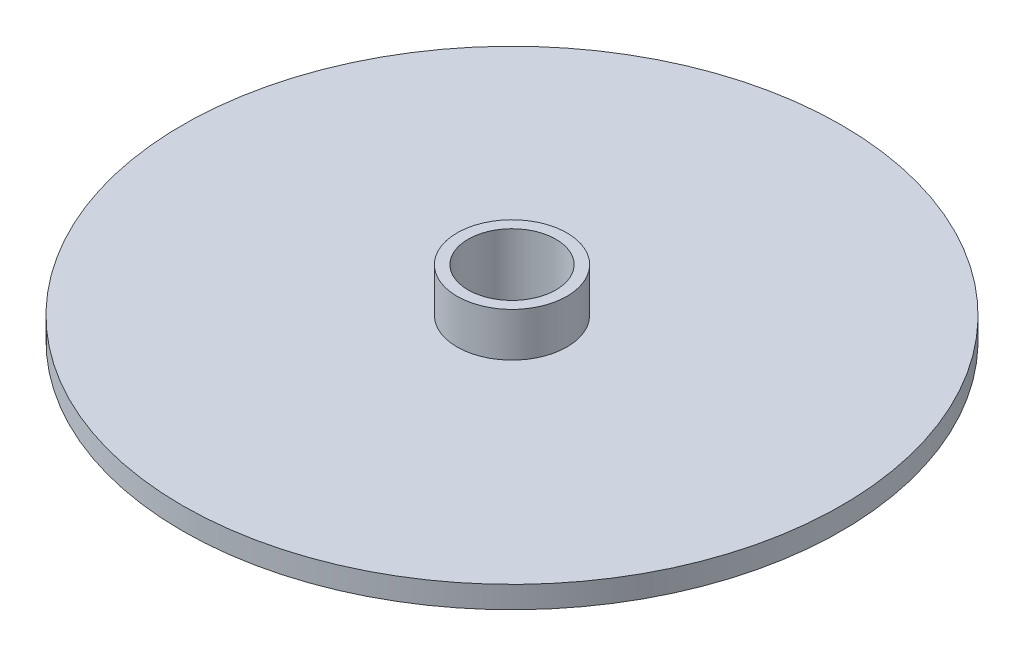
ISO-10303-21;
HEADER;
FILE_DESCRIPTION(('STEP AP214'),'2;1');
FILE_NAME('part.step','',(''),(''),'','','');
FILE_SCHEMA(('AUTOMOTIVE_DESIGN { 1 0 10303 214 1 1 1 1 }'));
ENDSEC;
DATA;
#1=APPLICATION_CONTEXT('core data for automotive mechanical design processes');
#2=APPLICATION_PROTOCOL_DEFINITION('international standard','automotive_design',2000,#1);
#3=PRODUCT_CONTEXT('',#1,'mechanical');
#4=PRODUCT('Part','Part','',(#3));
#5=PRODUCT_RELATED_PRODUCT_CATEGORY('part','',(#4));
#6=PRODUCT_DEFINITION_FORMATION('','',#4);
#7=PRODUCT_DEFINITION_CONTEXT('part definition',#1,'design');
#8=PRODUCT_DEFINITION('design','',#6,#7);
#9=PRODUCT_DEFINITION_SHAPE('','',#8);
#10=(LENGTH_UNIT() NAMED_UNIT(*) SI_UNIT(.MILLI.,.METRE.));
#11=(NAMED_UNIT(*) PLANE_ANGLE_UNIT() SI_UNIT($,.RADIAN.));
#12=(NAMED_UNIT(*) SI_UNIT($,.STERADIAN.) SOLID_ANGLE_UNIT());
#13=UNCERTAINTY_MEASURE_WITH_UNIT(LENGTH_MEASURE(1.E-05),#10,'distance_accuracy_value','');
#14=(GEOMETRIC_REPRESENTATION_CONTEXT(3) GLOBAL_UNCERTAINTY_ASSIGNED_CONTEXT((#13)) GLOBAL_UNIT_ASSIGNED_CONTEXT((#10,
#11,#12)) REPRESENTATION_CONTEXT('',''));
#15=CARTESIAN_POINT('',(0.,0.,0.));
#16=DIRECTION('',(0.,0.,1.));
#17=DIRECTION('',(1.,0.,0.));
#18=AXIS2_PLACEMENT_3D('',#15,#16,#17);
#19=CARTESIAN_POINT('',(0.,10.,0.));
#20=DIRECTION('',(0.,1.,0.));
#21=DIRECTION('',(0.,0.,1.));
#22=AXIS2_PLACEMENT_3D('',#19,#20,#21);
#23=PLANE('',#22);
#24=CARTESIAN_POINT('',(0.,10.,0.));
#25=DIRECTION('',(0.,1.,0.));
#26=DIRECTION('',(0.,0.,1.));
#27=AXIS2_PLACEMENT_3D('',#24,#25,#26);
#28=CIRCLE('',#27,150.);
#29=CARTESIAN_POINT('',(0.,10.,150.));
#30=VERTEX_POINT('',#29);
#31=EDGE_CURVE('E10',#30,#30,#28,.T.);
#32=ORIENTED_EDGE('',*,*,#31,.T.);
#33=EDGE_LOOP('',(#32));
#34=FACE_BOUND('',#33,.T.);
#35=CARTESIAN_POINT('',(0.,10.,0.));
#36=DIRECTION('',(0.,1.,0.));
#37=DIRECTION('',(0.,0.,1.));
#38=AXIS2_PLACEMENT_3D('',#35,#36,#37);
#39=CIRCLE('',#38,25.);
#40=CARTESIAN_POINT('',(0.,10.,25.));
#41=VERTEX_POINT('',#40);
#42=EDGE_CURVE('E55',#41,#41,#39,.T.);
#43=ORIENTED_EDGE('',*,*,#42,.F.);
#44=EDGE_LOOP('',(#43));
#45=FACE_BOUND('',#44,.T.);
#46=ADVANCED_FACE('F39',(#34,#45),#23,.T.);
#47=CARTESIAN_POINT('',(0.,10.,0.));
#48=DIRECTION('',(0.,-1.,0.));
#49=DIRECTION('',(0.,0.,-1.));
#50=AXIS2_PLACEMENT_3D('',#47,#48,#49);
#51=CYLINDRICAL_SURFACE('',#50,150.);
#52=ORIENTED_EDGE('',*,*,#31,.F.);
#53=EDGE_LOOP('',(#52));
#54=FACE_BOUND('',#53,.T.);
#55=CARTESIAN_POINT('',(0.,0.,0.));
#56=DIRECTION('',(0.,1.,0.));
#57=DIRECTION('',(0.,0.,1.));
#58=AXIS2_PLACEMENT_3D('',#55,#56,#57);
#59=CIRCLE('',#58,150.);
#60=CARTESIAN_POINT('',(0.,0.,150.));
#61=VERTEX_POINT('',#60);
#62=EDGE_CURVE('E53',#61,#61,#59,.T.);
#63=ORIENTED_EDGE('',*,*,#62,.T.);
#64=EDGE_LOOP('',(#63));
#65=FACE_BOUND('',#64,.T.);
#66=ADVANCED_FACE('F41',(#54,#65),#51,.T.);
#67=CARTESIAN_POINT('',(0.,10.,0.));
#68=DIRECTION('',(0.,-1.,0.));
#69=DIRECTION('',(0.,0.,-1.));
#70=AXIS2_PLACEMENT_3D('',#67,#68,#69);
#71=CYLINDRICAL_SURFACE('',#70,20.);
#72=CARTESIAN_POINT('',(0.,0.,0.));
#73=DIRECTION('',(0.,1.,0.));
#74=DIRECTION('',(0.,0.,1.));
#75=AXIS2_PLACEMENT_3D('',#72,#73,#74);
#76=CIRCLE('',#75,20.);
#77=CARTESIAN_POINT('',(0.,0.,20.));
#78=VERTEX_POINT('',#77);
#79=EDGE_CURVE('E43',#78,#78,#76,.T.);
#80=ORIENTED_EDGE('',*,*,#79,.F.);
#81=EDGE_LOOP('',(#80));
#82=FACE_BOUND('',#81,.T.);
#83=CARTESIAN_POINT('',(0.,30.,0.));
#84=DIRECTION('',(0.,1.,0.));
#85=DIRECTION('',(0.,0.,1.));
#86=AXIS2_PLACEMENT_3D('',#83,#84,#85);
#87=CIRCLE('',#86,20.);
#88=CARTESIAN_POINT('',(0.,30.,20.));
#89=VERTEX_POINT('',#88);
#90=EDGE_CURVE('E68',#89,#89,#87,.T.);
#91=ORIENTED_EDGE('',*,*,#90,.T.);
#92=EDGE_LOOP('',(#91));
#93=FACE_BOUND('',#92,.T.);
#94=ADVANCED_FACE('F74',(#82,#93),#71,.F.);
#95=CARTESIAN_POINT('',(0.,0.,0.));
#96=DIRECTION('',(0.,1.,0.));
#97=DIRECTION('',(0.,0.,1.));
#98=AXIS2_PLACEMENT_3D('',#95,#96,#97);
#99=PLANE('',#98);
#100=ORIENTED_EDGE('',*,*,#62,.F.);
#101=EDGE_LOOP('',(#100));
#102=FACE_BOUND('',#101,.T.);
#103=ORIENTED_EDGE('',*,*,#79,.T.);
#104=EDGE_LOOP('',(#103));
#105=FACE_BOUND('',#104,.T.);
#106=ADVANCED_FACE('F79',(#102,#105),#99,.F.);
#107=CARTESIAN_POINT('',(0.,30.,0.));
#108=DIRECTION('',(0.,1.,0.));
#109=DIRECTION('',(0.,0.,1.));
#110=AXIS2_PLACEMENT_3D('',#107,#108,#109);
#111=PLANE('',#110);
#112=CARTESIAN_POINT('',(0.,30.,0.));
#113=DIRECTION('',(0.,1.,0.));
#114=DIRECTION('',(0.,0.,1.));
#115=AXIS2_PLACEMENT_3D('',#112,#113,#114);
#116=CIRCLE('',#115,25.);
#117=CARTESIAN_POINT('',(0.,30.,25.));
#118=VERTEX_POINT('',#117);
#119=EDGE_CURVE('E59',#118,#118,#116,.T.);
#120=ORIENTED_EDGE('',*,*,#119,.T.);
#121=EDGE_LOOP('',(#120));
#122=FACE_BOUND('',#121,.T.);
#123=ORIENTED_EDGE('',*,*,#90,.F.);
#124=EDGE_LOOP('',(#123));
#125=FACE_BOUND('',#124,.T.);
#126=ADVANCED_FACE('F76',(#122,#125),#111,.T.);
#127=CARTESIAN_POINT('',(0.,30.,0.));
#128=DIRECTION('',(0.,-1.,0.));
#129=DIRECTION('',(0.,0.,-1.));
#130=AXIS2_PLACEMENT_3D('',#127,#128,#129);
#131=CYLINDRICAL_SURFACE('',#130,25.);
#132=ORIENTED_EDGE('',*,*,#119,.F.);
#133=EDGE_LOOP('',(#132));
#134=FACE_BOUND('',#133,.T.);
#135=ORIENTED_EDGE('',*,*,#42,.T.);
#136=EDGE_LOOP('',(#135));
#137=FACE_BOUND('',#136,.T.);
#138=ADVANCED_FACE('F78',(#134,#137),#131,.T.);
#139=CLOSED_SHELL('',(#46,#66,#94,#106,#126,#138));
#140=MANIFOLD_SOLID_BREP('B2',#139);
#141=ADVANCED_BREP_SHAPE_REPRESENTATION('',(#18,#140),#14);
#142=SHAPE_DEFINITION_REPRESENTATION(#9,#141);
ENDSEC;
END-ISO-10303-21;
